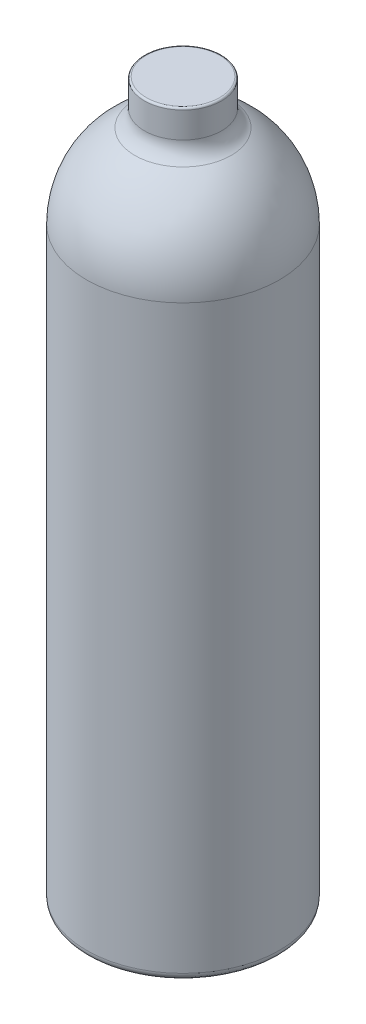
ISO-10303-21;
HEADER;
FILE_DESCRIPTION(('STEP AP214'),'2;1');
FILE_NAME('part.step','',(''),(''),'','','');
FILE_SCHEMA(('AUTOMOTIVE_DESIGN { 1 0 10303 214 1 1 1 1 }'));
ENDSEC;
DATA;
#1=APPLICATION_CONTEXT('core data for automotive mechanical design processes');
#2=APPLICATION_PROTOCOL_DEFINITION('international standard','automotive_design',2000,#1);
#3=PRODUCT_CONTEXT('',#1,'mechanical');
#4=PRODUCT('Part','Part','',(#3));
#5=PRODUCT_RELATED_PRODUCT_CATEGORY('part','',(#4));
#6=PRODUCT_DEFINITION_FORMATION('','',#4);
#7=PRODUCT_DEFINITION_CONTEXT('part definition',#1,'design');
#8=PRODUCT_DEFINITION('design','',#6,#7);
#9=PRODUCT_DEFINITION_SHAPE('','',#8);
#10=(LENGTH_UNIT() NAMED_UNIT(*) SI_UNIT(.MILLI.,.METRE.));
#11=(NAMED_UNIT(*) PLANE_ANGLE_UNIT() SI_UNIT($,.RADIAN.));
#12=(NAMED_UNIT(*) SI_UNIT($,.STERADIAN.) SOLID_ANGLE_UNIT());
#13=UNCERTAINTY_MEASURE_WITH_UNIT(LENGTH_MEASURE(1.E-05),#10,'distance_accuracy_value','');
#14=(GEOMETRIC_REPRESENTATION_CONTEXT(3) GLOBAL_UNCERTAINTY_ASSIGNED_CONTEXT((#13)) GLOBAL_UNIT_ASSIGNED_CONTEXT((#10,
#11,#12)) REPRESENTATION_CONTEXT('',''));
#15=CARTESIAN_POINT('',(0.,0.,0.));
#16=DIRECTION('',(0.,0.,1.));
#17=DIRECTION('',(1.,0.,0.));
#18=AXIS2_PLACEMENT_3D('',#15,#16,#17);
#19=CARTESIAN_POINT('',(0.,0.888999999999999,0.));
#20=DIRECTION('',(0.,1.,0.));
#21=DIRECTION('',(-1.,0.,0.));
#22=AXIS2_PLACEMENT_3D('',#19,#20,#21);
#23=PLANE('',#22);
#24=CARTESIAN_POINT('',(0.,0.888999999999999,0.));
#25=DIRECTION('',(0.,1.,0.));
#26=DIRECTION('',(-1.,0.,0.));
#27=AXIS2_PLACEMENT_3D('',#24,#25,#26);
#28=CIRCLE('',#27,21.1837671124965);
#29=CARTESIAN_POINT('',(-21.1837671124965,0.888999999999996,0.));
#30=VERTEX_POINT('',#29);
#31=EDGE_CURVE('E61',#30,#30,#28,.F.);
#32=ORIENTED_EDGE('',*,*,#31,.T.);
#33=EDGE_LOOP('',(#32));
#34=FACE_BOUND('',#33,.T.);
#35=ADVANCED_FACE('F35',(#34),#23,.F.);
#36=CARTESIAN_POINT('',(23.114,0.,0.));
#37=DIRECTION('',(0.,1.,0.));
#38=DIRECTION('',(-1.,0.,0.));
#39=AXIS2_PLACEMENT_3D('',#36,#37,#38);
#40=PLANE('',#39);
#41=CARTESIAN_POINT('',(0.,0.,0.));
#42=DIRECTION('',(0.,1.,0.));
#43=DIRECTION('',(-1.,0.,0.));
#44=AXIS2_PLACEMENT_3D('',#41,#42,#43);
#45=CIRCLE('',#44,29.5275);
#46=CARTESIAN_POINT('',(-29.5275,0.,0.));
#47=VERTEX_POINT('',#46);
#48=EDGE_CURVE('E55',#47,#47,#45,.F.);
#49=ORIENTED_EDGE('',*,*,#48,.T.);
#50=EDGE_LOOP('',(#49));
#51=FACE_BOUND('',#50,.T.);
#52=CARTESIAN_POINT('',(0.,0.,0.));
#53=DIRECTION('',(0.,1.,0.));
#54=DIRECTION('',(-1.,0.,0.));
#55=AXIS2_PLACEMENT_3D('',#52,#53,#54);
#56=CIRCLE('',#55,23.114);
#57=CARTESIAN_POINT('',(-23.1139999999999,0.,0.));
#58=VERTEX_POINT('',#57);
#59=EDGE_CURVE('E64',#58,#58,#56,.T.);
#60=ORIENTED_EDGE('',*,*,#59,.T.);
#61=EDGE_LOOP('',(#60));
#62=FACE_BOUND('',#61,.T.);
#63=ADVANCED_FACE('F75',(#51,#62),#40,.F.);
#64=CARTESIAN_POINT('',(0.,238.125,0.));
#65=DIRECTION('',(0.,1.,0.));
#66=DIRECTION('',(-1.,0.,0.));
#67=AXIS2_PLACEMENT_3D('',#64,#65,#66);
#68=CYLINDRICAL_SURFACE('',#67,32.0675);
#69=CARTESIAN_POINT('',(0.,2.53999999999999,0.));
#70=DIRECTION('',(0.,1.,0.));
#71=DIRECTION('',(-1.,0.,0.));
#72=AXIS2_PLACEMENT_3D('',#69,#70,#71);
#73=CIRCLE('',#72,32.0675);
#74=CARTESIAN_POINT('',(-32.0675,2.53999999999998,0.));
#75=VERTEX_POINT('',#74);
#76=EDGE_CURVE('E58',#75,#75,#73,.T.);
#77=ORIENTED_EDGE('',*,*,#76,.T.);
#78=EDGE_LOOP('',(#77));
#79=FACE_BOUND('',#78,.T.);
#80=CARTESIAN_POINT('',(0.,195.58,0.));
#81=DIRECTION('',(0.,1.,0.));
#82=DIRECTION('',(-1.,0.,0.));
#83=AXIS2_PLACEMENT_3D('',#80,#81,#82);
#84=CIRCLE('',#83,32.0675);
#85=CARTESIAN_POINT('',(-32.0675,195.58,0.));
#86=VERTEX_POINT('',#85);
#87=EDGE_CURVE('E67',#86,#86,#84,.T.);
#88=ORIENTED_EDGE('',*,*,#87,.F.);
#89=EDGE_LOOP('',(#88));
#90=FACE_BOUND('',#89,.T.);
#91=ADVANCED_FACE('F73',(#79,#90),#68,.T.);
#92=CARTESIAN_POINT('',(0.,195.58,0.));
#93=DIRECTION('',(0.,1.,0.));
#94=DIRECTION('',(1.,0.,0.));
#95=AXIS2_PLACEMENT_3D('',#92,#93,#94);
#96=SPHERICAL_SURFACE('',#95,32.0675);
#97=CARTESIAN_POINT('',(0.,223.366553759564,0.));
#98=DIRECTION('',(0.,-1.,0.));
#99=DIRECTION('',(1.,0.,0.));
#100=AXIS2_PLACEMENT_3D('',#97,#98,#99);
#101=CIRCLE('',#100,16.0072479338843);
#102=CARTESIAN_POINT('',(16.0072479338843,223.366553759564,0.));
#103=VERTEX_POINT('',#102);
#104=EDGE_CURVE('E10',#103,#103,#101,.T.);
#105=ORIENTED_EDGE('',*,*,#104,.T.);
#106=EDGE_LOOP('',(#105));
#107=FACE_BOUND('',#106,.T.);
#108=ORIENTED_EDGE('',*,*,#87,.T.);
#109=EDGE_LOOP('',(#108));
#110=FACE_BOUND('',#109,.T.);
#111=ADVANCED_FACE('F71',(#107,#110),#96,.T.);
#112=CARTESIAN_POINT('',(0.,238.125,0.));
#113=DIRECTION('',(0.,1.,0.));
#114=DIRECTION('',(-1.,0.,0.));
#115=AXIS2_PLACEMENT_3D('',#112,#113,#114);
#116=CYLINDRICAL_SURFACE('',#115,12.827);
#117=CARTESIAN_POINT('',(0.,228.868841632745,0.));
#118=DIRECTION('',(0.,-1.,0.));
#119=DIRECTION('',(1.,0.,0.));
#120=AXIS2_PLACEMENT_3D('',#117,#118,#119);
#121=CIRCLE('',#120,12.827);
#122=CARTESIAN_POINT('',(12.827,228.868841632745,0.));
#123=VERTEX_POINT('',#122);
#124=EDGE_CURVE('E42',#123,#123,#121,.F.);
#125=ORIENTED_EDGE('',*,*,#124,.T.);
#126=EDGE_LOOP('',(#125));
#127=FACE_BOUND('',#126,.T.);
#128=CARTESIAN_POINT('',(0.,237.49,0.));
#129=DIRECTION('',(0.,-1.,0.));
#130=DIRECTION('',(1.,0.,0.));
#131=AXIS2_PLACEMENT_3D('',#128,#129,#130);
#132=CIRCLE('',#131,12.827);
#133=CARTESIAN_POINT('',(12.827,237.49,0.));
#134=VERTEX_POINT('',#133);
#135=EDGE_CURVE('E46',#134,#134,#132,.T.);
#136=ORIENTED_EDGE('',*,*,#135,.T.);
#137=EDGE_LOOP('',(#136));
#138=FACE_BOUND('',#137,.T.);
#139=ADVANCED_FACE('F82',(#127,#138),#116,.T.);
#140=CARTESIAN_POINT('',(0.,238.125,0.));
#141=DIRECTION('',(0.,-1.,0.));
#142=DIRECTION('',(1.,0.,0.));
#143=AXIS2_PLACEMENT_3D('',#140,#141,#142);
#144=PLANE('',#143);
#145=CARTESIAN_POINT('',(0.,238.125,0.));
#146=DIRECTION('',(0.,-1.,0.));
#147=DIRECTION('',(1.,0.,0.));
#148=AXIS2_PLACEMENT_3D('',#145,#146,#147);
#149=CIRCLE('',#148,12.192);
#150=CARTESIAN_POINT('',(12.192,238.125,0.));
#151=VERTEX_POINT('',#150);
#152=EDGE_CURVE('E50',#151,#151,#149,.F.);
#153=ORIENTED_EDGE('',*,*,#152,.T.);
#154=EDGE_LOOP('',(#153));
#155=FACE_BOUND('',#154,.T.);
#156=ADVANCED_FACE('F96',(#155),#144,.F.);
#157=CARTESIAN_POINT('',(0.,-1.651,0.));
#158=DIRECTION('',(0.,-1.,0.));
#159=DIRECTION('',(1.,0.,0.));
#160=AXIS2_PLACEMENT_3D('',#157,#158,#159);
#161=TOROIDAL_SURFACE('',#160,21.1837671124965,2.54);
#162=ORIENTED_EDGE('',*,*,#31,.F.);
#163=EDGE_LOOP('',(#162));
#164=FACE_BOUND('',#163,.T.);
#165=ORIENTED_EDGE('',*,*,#59,.F.);
#166=EDGE_LOOP('',(#165));
#167=FACE_BOUND('',#166,.T.);
#168=ADVANCED_FACE('F92',(#164,#167),#161,.F.);
#169=CARTESIAN_POINT('',(0.,2.53999999999999,0.));
#170=DIRECTION('',(0.,1.,0.));
#171=DIRECTION('',(-1.,0.,0.));
#172=AXIS2_PLACEMENT_3D('',#169,#170,#171);
#173=TOROIDAL_SURFACE('',#172,29.5275,2.54);
#174=ORIENTED_EDGE('',*,*,#48,.F.);
#175=EDGE_LOOP('',(#174));
#176=FACE_BOUND('',#175,.T.);
#177=ORIENTED_EDGE('',*,*,#76,.F.);
#178=EDGE_LOOP('',(#177));
#179=FACE_BOUND('',#178,.T.);
#180=ADVANCED_FACE('F95',(#176,#179),#173,.T.);
#181=CARTESIAN_POINT('',(0.,237.49,0.));
#182=DIRECTION('',(0.,-1.,0.));
#183=DIRECTION('',(1.,0.,0.));
#184=AXIS2_PLACEMENT_3D('',#181,#182,#183);
#185=TOROIDAL_SURFACE('',#184,12.192,0.635);
#186=ORIENTED_EDGE('',*,*,#135,.F.);
#187=EDGE_LOOP('',(#186));
#188=FACE_BOUND('',#187,.T.);
#189=ORIENTED_EDGE('',*,*,#152,.F.);
#190=EDGE_LOOP('',(#189));
#191=FACE_BOUND('',#190,.T.);
#192=ADVANCED_FACE('F99',(#188,#191),#185,.T.);
#193=CARTESIAN_POINT('',(0.,228.868841632745,0.));
#194=DIRECTION('',(0.,-1.,0.));
#195=DIRECTION('',(1.,0.,0.));
#196=AXIS2_PLACEMENT_3D('',#193,#194,#195);
#197=TOROIDAL_SURFACE('',#196,19.177,6.35);
#198=ORIENTED_EDGE('',*,*,#104,.F.);
#199=EDGE_LOOP('',(#198));
#200=FACE_BOUND('',#199,.T.);
#201=ORIENTED_EDGE('',*,*,#124,.F.);
#202=EDGE_LOOP('',(#201));
#203=FACE_BOUND('',#202,.T.);
#204=ADVANCED_FACE('F37',(#200,#203),#197,.F.);
#205=CLOSED_SHELL('',(#35,#63,#91,#111,#139,#156,#168,#180,#192,#204));
#206=MANIFOLD_SOLID_BREP('B2',#205);
#207=ADVANCED_BREP_SHAPE_REPRESENTATION('',(#18,#206),#14);
#208=SHAPE_DEFINITION_REPRESENTATION(#9,#207);
ENDSEC;
END-ISO-10303-21;
